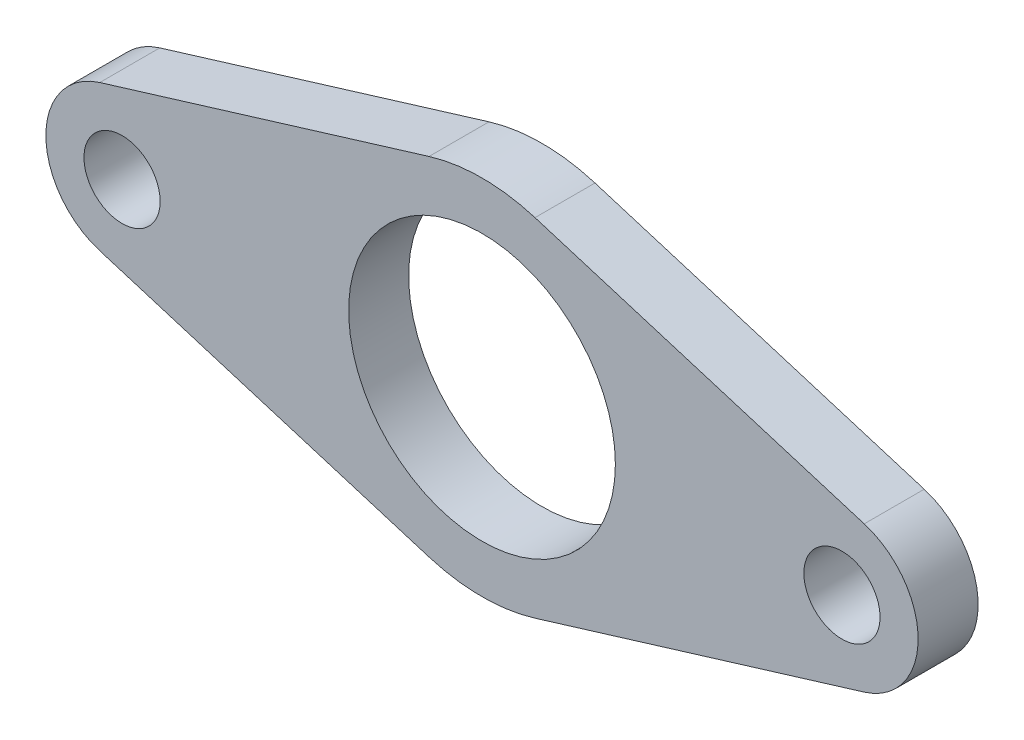
ISO-10303-21;
HEADER;
FILE_DESCRIPTION(('STEP AP214'),'2;1');
FILE_NAME('part.step','',(''),(''),'','','');
FILE_SCHEMA(('AUTOMOTIVE_DESIGN { 1 0 10303 214 1 1 1 1 }'));
ENDSEC;
DATA;
#1=APPLICATION_CONTEXT('core data for automotive mechanical design processes');
#2=APPLICATION_PROTOCOL_DEFINITION('international standard','automotive_design',2000,#1);
#3=PRODUCT_CONTEXT('',#1,'mechanical');
#4=PRODUCT('Part','Part','',(#3));
#5=PRODUCT_RELATED_PRODUCT_CATEGORY('part','',(#4));
#6=PRODUCT_DEFINITION_FORMATION('','',#4);
#7=PRODUCT_DEFINITION_CONTEXT('part definition',#1,'design');
#8=PRODUCT_DEFINITION('design','',#6,#7);
#9=PRODUCT_DEFINITION_SHAPE('','',#8);
#10=(LENGTH_UNIT() NAMED_UNIT(*) SI_UNIT(.MILLI.,.METRE.));
#11=(NAMED_UNIT(*) PLANE_ANGLE_UNIT() SI_UNIT($,.RADIAN.));
#12=(NAMED_UNIT(*) SI_UNIT($,.STERADIAN.) SOLID_ANGLE_UNIT());
#13=UNCERTAINTY_MEASURE_WITH_UNIT(LENGTH_MEASURE(1.E-05),#10,'distance_accuracy_value','');
#14=(GEOMETRIC_REPRESENTATION_CONTEXT(3) GLOBAL_UNCERTAINTY_ASSIGNED_CONTEXT((#13)) GLOBAL_UNIT_ASSIGNED_CONTEXT((#10,
#11,#12)) REPRESENTATION_CONTEXT('',''));
#15=CARTESIAN_POINT('',(0.,0.,0.));
#16=DIRECTION('',(0.,0.,1.));
#17=DIRECTION('',(1.,0.,0.));
#18=AXIS2_PLACEMENT_3D('',#15,#16,#17);
#19=CARTESIAN_POINT('',(-30.,0.,5.));
#20=DIRECTION('',(0.,0.,1.));
#21=DIRECTION('',(1.,0.,0.));
#22=AXIS2_PLACEMENT_3D('',#19,#20,#21);
#23=PLANE('',#22);
#24=CARTESIAN_POINT('',(-30.,0.,5.));
#25=DIRECTION('',(0.,0.,1.));
#26=DIRECTION('',(1.,0.,0.));
#27=AXIS2_PLACEMENT_3D('',#24,#25,#26);
#28=CIRCLE('',#27,3.175);
#29=CARTESIAN_POINT('',(-26.825,0.,5.));
#30=VERTEX_POINT('',#29);
#31=EDGE_CURVE('E185',#30,#30,#28,.T.);
#32=ORIENTED_EDGE('',*,*,#31,.F.);
#33=EDGE_LOOP('',(#32));
#34=FACE_BOUND('',#33,.T.);
#35=CARTESIAN_POINT('',(-30.,0.,5.));
#36=DIRECTION('',(0.,0.,1.));
#37=DIRECTION('',(1.,0.,0.));
#38=AXIS2_PLACEMENT_3D('',#35,#36,#37);
#39=CIRCLE('',#38,6.35);
#40=CARTESIAN_POINT('',(-31.8552583333333,6.07293310654722,5.));
#41=VERTEX_POINT('',#40);
#42=CARTESIAN_POINT('',(-31.8552583333333,-6.07293310654722,5.));
#43=VERTEX_POINT('',#42);
#44=EDGE_CURVE('E148',#41,#43,#39,.T.);
#45=ORIENTED_EDGE('',*,*,#44,.T.);
#46=DIRECTION('',(0.956367418353892,-0.292166666666667,0.));
#47=VECTOR('',#46,1.);
#48=CARTESIAN_POINT('',(-31.8552583333333,-6.07293310654722,5.));
#49=LINE('',#48,#47);
#50=CARTESIAN_POINT('',(-4.41609916666667,-14.4554935284191,5.));
#51=VERTEX_POINT('',#50);
#52=EDGE_CURVE('E96',#43,#51,#49,.T.);
#53=ORIENTED_EDGE('',*,*,#52,.T.);
#54=CARTESIAN_POINT('',(0.,0.,5.));
#55=DIRECTION('',(0.,0.,1.));
#56=DIRECTION('',(1.,0.,0.));
#57=AXIS2_PLACEMENT_3D('',#54,#55,#56);
#58=CIRCLE('',#57,15.115);
#59=CARTESIAN_POINT('',(4.41609916666667,-14.4554935284191,5.));
#60=VERTEX_POINT('',#59);
#61=EDGE_CURVE('E163',#51,#60,#58,.T.);
#62=ORIENTED_EDGE('',*,*,#61,.T.);
#63=DIRECTION('',(0.956367418353892,0.292166666666667,0.));
#64=VECTOR('',#63,1.);
#65=CARTESIAN_POINT('',(31.8552583333333,-6.07293310654722,5.));
#66=LINE('',#65,#64);
#67=CARTESIAN_POINT('',(31.8552583333333,-6.07293310654721,5.));
#68=VERTEX_POINT('',#67);
#69=EDGE_CURVE('E176',#60,#68,#66,.T.);
#70=ORIENTED_EDGE('',*,*,#69,.T.);
#71=CARTESIAN_POINT('',(30.,0.,5.));
#72=DIRECTION('',(0.,0.,1.));
#73=DIRECTION('',(-1.,0.,0.));
#74=AXIS2_PLACEMENT_3D('',#71,#72,#73);
#75=CIRCLE('',#74,6.35);
#76=CARTESIAN_POINT('',(31.8552583333333,6.07293310654722,5.));
#77=VERTEX_POINT('',#76);
#78=EDGE_CURVE('E115',#68,#77,#75,.T.);
#79=ORIENTED_EDGE('',*,*,#78,.T.);
#80=DIRECTION('',(-0.956367418353892,0.292166666666667,0.));
#81=VECTOR('',#80,1.);
#82=CARTESIAN_POINT('',(31.8552583333333,6.07293310654722,5.));
#83=LINE('',#82,#81);
#84=CARTESIAN_POINT('',(4.41609916666667,14.4554935284191,5.));
#85=VERTEX_POINT('',#84);
#86=EDGE_CURVE('E109',#77,#85,#83,.T.);
#87=ORIENTED_EDGE('',*,*,#86,.T.);
#88=CARTESIAN_POINT('',(0.,0.,5.));
#89=DIRECTION('',(0.,0.,1.));
#90=DIRECTION('',(1.,0.,0.));
#91=AXIS2_PLACEMENT_3D('',#88,#89,#90);
#92=CIRCLE('',#91,15.115);
#93=CARTESIAN_POINT('',(-4.41609916666667,14.4554935284191,5.));
#94=VERTEX_POINT('',#93);
#95=EDGE_CURVE('E113',#85,#94,#92,.T.);
#96=ORIENTED_EDGE('',*,*,#95,.T.);
#97=DIRECTION('',(-0.956367418353892,-0.292166666666667,0.));
#98=VECTOR('',#97,1.);
#99=CARTESIAN_POINT('',(-31.8552583333333,6.07293310654722,5.));
#100=LINE('',#99,#98);
#101=EDGE_CURVE('E53',#94,#41,#100,.T.);
#102=ORIENTED_EDGE('',*,*,#101,.T.);
#103=EDGE_LOOP('',(#45,#53,#62,#70,#79,#87,#96,#102));
#104=FACE_BOUND('',#103,.T.);
#105=CARTESIAN_POINT('',(0.,0.,5.));
#106=DIRECTION('',(0.,0.,1.));
#107=DIRECTION('',(1.,0.,0.));
#108=AXIS2_PLACEMENT_3D('',#105,#106,#107);
#109=CIRCLE('',#108,11.115);
#110=CARTESIAN_POINT('',(11.115,0.,5.));
#111=VERTEX_POINT('',#110);
#112=EDGE_CURVE('E137',#111,#111,#109,.T.);
#113=ORIENTED_EDGE('',*,*,#112,.F.);
#114=EDGE_LOOP('',(#113));
#115=FACE_BOUND('',#114,.T.);
#116=CARTESIAN_POINT('',(30.,0.,5.));
#117=DIRECTION('',(0.,0.,1.));
#118=DIRECTION('',(-1.,0.,0.));
#119=AXIS2_PLACEMENT_3D('',#116,#117,#118);
#120=CIRCLE('',#119,3.175);
#121=CARTESIAN_POINT('',(26.825,0.,5.));
#122=VERTEX_POINT('',#121);
#123=EDGE_CURVE('E191',#122,#122,#120,.T.);
#124=ORIENTED_EDGE('',*,*,#123,.F.);
#125=EDGE_LOOP('',(#124));
#126=FACE_BOUND('',#125,.T.);
#127=ADVANCED_FACE('F36',(#34,#104,#115,#126),#23,.T.);
#128=CARTESIAN_POINT('',(-30.,0.,0.));
#129=DIRECTION('',(0.,0.,1.));
#130=DIRECTION('',(1.,0.,0.));
#131=AXIS2_PLACEMENT_3D('',#128,#129,#130);
#132=PLANE('',#131);
#133=CARTESIAN_POINT('',(-30.,0.,0.));
#134=DIRECTION('',(0.,0.,1.));
#135=DIRECTION('',(1.,0.,0.));
#136=AXIS2_PLACEMENT_3D('',#133,#134,#135);
#137=CIRCLE('',#136,6.35);
#138=CARTESIAN_POINT('',(-31.8552583333333,6.07293310654722,0.));
#139=VERTEX_POINT('',#138);
#140=CARTESIAN_POINT('',(-31.8552583333333,-6.07293310654722,0.));
#141=VERTEX_POINT('',#140);
#142=EDGE_CURVE('E133',#139,#141,#137,.T.);
#143=ORIENTED_EDGE('',*,*,#142,.F.);
#144=DIRECTION('',(-0.956367418353892,-0.292166666666667,0.));
#145=VECTOR('',#144,1.);
#146=CARTESIAN_POINT('',(-31.8552583333333,6.07293310654722,0.));
#147=LINE('',#146,#145);
#148=CARTESIAN_POINT('',(-4.41609916666667,14.4554935284191,0.));
#149=VERTEX_POINT('',#148);
#150=EDGE_CURVE('E88',#149,#139,#147,.T.);
#151=ORIENTED_EDGE('',*,*,#150,.F.);
#152=CARTESIAN_POINT('',(0.,0.,0.));
#153=DIRECTION('',(0.,0.,1.));
#154=DIRECTION('',(1.,0.,0.));
#155=AXIS2_PLACEMENT_3D('',#152,#153,#154);
#156=CIRCLE('',#155,15.115);
#157=CARTESIAN_POINT('',(4.41609916666667,14.4554935284191,0.));
#158=VERTEX_POINT('',#157);
#159=EDGE_CURVE('E82',#158,#149,#156,.T.);
#160=ORIENTED_EDGE('',*,*,#159,.F.);
#161=DIRECTION('',(-0.956367418353892,0.292166666666667,0.));
#162=VECTOR('',#161,1.);
#163=CARTESIAN_POINT('',(31.8552583333333,6.07293310654722,0.));
#164=LINE('',#163,#162);
#165=CARTESIAN_POINT('',(31.8552583333333,6.07293310654722,0.));
#166=VERTEX_POINT('',#165);
#167=EDGE_CURVE('E123',#166,#158,#164,.T.);
#168=ORIENTED_EDGE('',*,*,#167,.F.);
#169=CARTESIAN_POINT('',(30.,0.,0.));
#170=DIRECTION('',(0.,0.,1.));
#171=DIRECTION('',(-1.,0.,0.));
#172=AXIS2_PLACEMENT_3D('',#169,#170,#171);
#173=CIRCLE('',#172,6.35);
#174=CARTESIAN_POINT('',(31.8552583333333,-6.07293310654721,0.));
#175=VERTEX_POINT('',#174);
#176=EDGE_CURVE('E143',#175,#166,#173,.T.);
#177=ORIENTED_EDGE('',*,*,#176,.F.);
#178=DIRECTION('',(0.956367418353892,0.292166666666667,0.));
#179=VECTOR('',#178,1.);
#180=CARTESIAN_POINT('',(31.8552583333333,-6.07293310654722,0.));
#181=LINE('',#180,#179);
#182=CARTESIAN_POINT('',(4.41609916666667,-14.4554935284191,0.));
#183=VERTEX_POINT('',#182);
#184=EDGE_CURVE('E141',#183,#175,#181,.T.);
#185=ORIENTED_EDGE('',*,*,#184,.F.);
#186=CARTESIAN_POINT('',(0.,0.,0.));
#187=DIRECTION('',(0.,0.,1.));
#188=DIRECTION('',(1.,0.,0.));
#189=AXIS2_PLACEMENT_3D('',#186,#187,#188);
#190=CIRCLE('',#189,15.115);
#191=CARTESIAN_POINT('',(-4.41609916666667,-14.4554935284191,0.));
#192=VERTEX_POINT('',#191);
#193=EDGE_CURVE('E139',#192,#183,#190,.T.);
#194=ORIENTED_EDGE('',*,*,#193,.F.);
#195=DIRECTION('',(0.956367418353892,-0.292166666666667,0.));
#196=VECTOR('',#195,1.);
#197=CARTESIAN_POINT('',(-31.8552583333333,-6.07293310654722,0.));
#198=LINE('',#197,#196);
#199=EDGE_CURVE('E136',#141,#192,#198,.T.);
#200=ORIENTED_EDGE('',*,*,#199,.F.);
#201=EDGE_LOOP('',(#143,#151,#160,#168,#177,#185,#194,#200));
#202=FACE_BOUND('',#201,.T.);
#203=CARTESIAN_POINT('',(0.,0.,0.));
#204=DIRECTION('',(0.,0.,1.));
#205=DIRECTION('',(1.,0.,0.));
#206=AXIS2_PLACEMENT_3D('',#203,#204,#205);
#207=CIRCLE('',#206,11.115);
#208=CARTESIAN_POINT('',(11.115,0.,0.));
#209=VERTEX_POINT('',#208);
#210=EDGE_CURVE('E182',#209,#209,#207,.T.);
#211=ORIENTED_EDGE('',*,*,#210,.T.);
#212=EDGE_LOOP('',(#211));
#213=FACE_BOUND('',#212,.T.);
#214=CARTESIAN_POINT('',(-30.,0.,0.));
#215=DIRECTION('',(0.,0.,1.));
#216=DIRECTION('',(1.,0.,0.));
#217=AXIS2_PLACEMENT_3D('',#214,#215,#216);
#218=CIRCLE('',#217,3.175);
#219=CARTESIAN_POINT('',(-26.825,0.,0.));
#220=VERTEX_POINT('',#219);
#221=EDGE_CURVE('E188',#220,#220,#218,.T.);
#222=ORIENTED_EDGE('',*,*,#221,.T.);
#223=EDGE_LOOP('',(#222));
#224=FACE_BOUND('',#223,.T.);
#225=CARTESIAN_POINT('',(30.,0.,0.));
#226=DIRECTION('',(0.,0.,1.));
#227=DIRECTION('',(-1.,0.,0.));
#228=AXIS2_PLACEMENT_3D('',#225,#226,#227);
#229=CIRCLE('',#228,3.175);
#230=CARTESIAN_POINT('',(26.825,0.,0.));
#231=VERTEX_POINT('',#230);
#232=EDGE_CURVE('E194',#231,#231,#229,.T.);
#233=ORIENTED_EDGE('',*,*,#232,.T.);
#234=EDGE_LOOP('',(#233));
#235=FACE_BOUND('',#234,.T.);
#236=ADVANCED_FACE('F167',(#202,#213,#224,#235),#132,.F.);
#237=CARTESIAN_POINT('',(-30.,0.,5.));
#238=DIRECTION('',(0.,0.,-1.));
#239=DIRECTION('',(-1.,0.,0.));
#240=AXIS2_PLACEMENT_3D('',#237,#238,#239);
#241=CYLINDRICAL_SURFACE('',#240,6.35);
#242=ORIENTED_EDGE('',*,*,#142,.T.);
#243=DIRECTION('',(0.,0.,-1.));
#244=VECTOR('',#243,1.);
#245=CARTESIAN_POINT('',(-31.8552583333333,-6.07293310654722,5.));
#246=LINE('',#245,#244);
#247=EDGE_CURVE('E11',#43,#141,#246,.T.);
#248=ORIENTED_EDGE('',*,*,#247,.F.);
#249=ORIENTED_EDGE('',*,*,#44,.F.);
#250=DIRECTION('',(0.,0.,-1.));
#251=VECTOR('',#250,1.);
#252=CARTESIAN_POINT('',(-31.8552583333333,6.07293310654722,5.));
#253=LINE('',#252,#251);
#254=EDGE_CURVE('E129',#41,#139,#253,.T.);
#255=ORIENTED_EDGE('',*,*,#254,.T.);
#256=EDGE_LOOP('',(#242,#248,#249,#255));
#257=FACE_BOUND('',#256,.T.);
#258=ADVANCED_FACE('F38',(#257),#241,.T.);
#259=CARTESIAN_POINT('',(-31.8552583333333,-6.07293310654722,5.));
#260=DIRECTION('',(0.292166666666667,0.956367418353892,0.));
#261=DIRECTION('',(-0.956367418353892,0.292166666666667,0.));
#262=AXIS2_PLACEMENT_3D('',#259,#260,#261);
#263=PLANE('',#262);
#264=ORIENTED_EDGE('',*,*,#199,.T.);
#265=DIRECTION('',(0.,0.,-1.));
#266=VECTOR('',#265,1.);
#267=CARTESIAN_POINT('',(-4.41609916666667,-14.4554935284191,5.));
#268=LINE('',#267,#266);
#269=EDGE_CURVE('E45',#51,#192,#268,.T.);
#270=ORIENTED_EDGE('',*,*,#269,.F.);
#271=ORIENTED_EDGE('',*,*,#52,.F.);
#272=ORIENTED_EDGE('',*,*,#247,.T.);
#273=EDGE_LOOP('',(#264,#270,#271,#272));
#274=FACE_BOUND('',#273,.T.);
#275=ADVANCED_FACE('F227',(#274),#263,.F.);
#276=CARTESIAN_POINT('',(0.,0.,5.));
#277=DIRECTION('',(0.,0.,-1.));
#278=DIRECTION('',(-1.,0.,0.));
#279=AXIS2_PLACEMENT_3D('',#276,#277,#278);
#280=CYLINDRICAL_SURFACE('',#279,15.115);
#281=ORIENTED_EDGE('',*,*,#193,.T.);
#282=DIRECTION('',(0.,0.,-1.));
#283=VECTOR('',#282,1.);
#284=CARTESIAN_POINT('',(4.41609916666667,-14.4554935284191,5.));
#285=LINE('',#284,#283);
#286=EDGE_CURVE('E155',#60,#183,#285,.T.);
#287=ORIENTED_EDGE('',*,*,#286,.F.);
#288=ORIENTED_EDGE('',*,*,#61,.F.);
#289=ORIENTED_EDGE('',*,*,#269,.T.);
#290=EDGE_LOOP('',(#281,#287,#288,#289));
#291=FACE_BOUND('',#290,.T.);
#292=ADVANCED_FACE('F161',(#291),#280,.T.);
#293=CARTESIAN_POINT('',(31.8552583333333,-6.07293310654722,5.));
#294=DIRECTION('',(-0.292166666666667,0.956367418353892,0.));
#295=DIRECTION('',(-0.956367418353892,-0.292166666666667,0.));
#296=AXIS2_PLACEMENT_3D('',#293,#294,#295);
#297=PLANE('',#296);
#298=ORIENTED_EDGE('',*,*,#184,.T.);
#299=DIRECTION('',(0.,0.,-1.));
#300=VECTOR('',#299,1.);
#301=CARTESIAN_POINT('',(31.8552583333333,-6.07293310654721,5.));
#302=LINE('',#301,#300);
#303=EDGE_CURVE('E152',#68,#175,#302,.T.);
#304=ORIENTED_EDGE('',*,*,#303,.F.);
#305=ORIENTED_EDGE('',*,*,#69,.F.);
#306=ORIENTED_EDGE('',*,*,#286,.T.);
#307=EDGE_LOOP('',(#298,#304,#305,#306));
#308=FACE_BOUND('',#307,.T.);
#309=ADVANCED_FACE('F172',(#308),#297,.F.);
#310=CARTESIAN_POINT('',(30.,0.,5.));
#311=DIRECTION('',(0.,0.,-1.));
#312=DIRECTION('',(-1.,0.,0.));
#313=AXIS2_PLACEMENT_3D('',#310,#311,#312);
#314=CYLINDRICAL_SURFACE('',#313,6.35);
#315=ORIENTED_EDGE('',*,*,#176,.T.);
#316=DIRECTION('',(0.,0.,-1.));
#317=VECTOR('',#316,1.);
#318=CARTESIAN_POINT('',(31.8552583333333,6.07293310654722,5.));
#319=LINE('',#318,#317);
#320=EDGE_CURVE('E124',#77,#166,#319,.T.);
#321=ORIENTED_EDGE('',*,*,#320,.F.);
#322=ORIENTED_EDGE('',*,*,#78,.F.);
#323=ORIENTED_EDGE('',*,*,#303,.T.);
#324=EDGE_LOOP('',(#315,#321,#322,#323));
#325=FACE_BOUND('',#324,.T.);
#326=ADVANCED_FACE('F175',(#325),#314,.T.);
#327=CARTESIAN_POINT('',(31.8552583333333,6.07293310654722,5.));
#328=DIRECTION('',(-0.292166666666667,-0.956367418353892,0.));
#329=DIRECTION('',(0.956367418353892,-0.292166666666667,0.));
#330=AXIS2_PLACEMENT_3D('',#327,#328,#329);
#331=PLANE('',#330);
#332=ORIENTED_EDGE('',*,*,#167,.T.);
#333=DIRECTION('',(0.,0.,-1.));
#334=VECTOR('',#333,1.);
#335=CARTESIAN_POINT('',(4.41609916666667,14.4554935284191,5.));
#336=LINE('',#335,#334);
#337=EDGE_CURVE('E120',#85,#158,#336,.T.);
#338=ORIENTED_EDGE('',*,*,#337,.F.);
#339=ORIENTED_EDGE('',*,*,#86,.F.);
#340=ORIENTED_EDGE('',*,*,#320,.T.);
#341=EDGE_LOOP('',(#332,#338,#339,#340));
#342=FACE_BOUND('',#341,.T.);
#343=ADVANCED_FACE('F121',(#342),#331,.F.);
#344=CARTESIAN_POINT('',(0.,0.,5.));
#345=DIRECTION('',(0.,0.,-1.));
#346=DIRECTION('',(-1.,0.,0.));
#347=AXIS2_PLACEMENT_3D('',#344,#345,#346);
#348=CYLINDRICAL_SURFACE('',#347,15.115);
#349=ORIENTED_EDGE('',*,*,#159,.T.);
#350=DIRECTION('',(0.,0.,-1.));
#351=VECTOR('',#350,1.);
#352=CARTESIAN_POINT('',(-4.41609916666667,14.4554935284191,5.));
#353=LINE('',#352,#351);
#354=EDGE_CURVE('E125',#94,#149,#353,.T.);
#355=ORIENTED_EDGE('',*,*,#354,.F.);
#356=ORIENTED_EDGE('',*,*,#95,.F.);
#357=ORIENTED_EDGE('',*,*,#337,.T.);
#358=EDGE_LOOP('',(#349,#355,#356,#357));
#359=FACE_BOUND('',#358,.T.);
#360=ADVANCED_FACE('F127',(#359),#348,.T.);
#361=CARTESIAN_POINT('',(-31.8552583333333,6.07293310654722,5.));
#362=DIRECTION('',(0.292166666666667,-0.956367418353892,0.));
#363=DIRECTION('',(0.956367418353892,0.292166666666667,0.));
#364=AXIS2_PLACEMENT_3D('',#361,#362,#363);
#365=PLANE('',#364);
#366=ORIENTED_EDGE('',*,*,#150,.T.);
#367=ORIENTED_EDGE('',*,*,#254,.F.);
#368=ORIENTED_EDGE('',*,*,#101,.F.);
#369=ORIENTED_EDGE('',*,*,#354,.T.);
#370=EDGE_LOOP('',(#366,#367,#368,#369));
#371=FACE_BOUND('',#370,.T.);
#372=ADVANCED_FACE('F215',(#371),#365,.F.);
#373=CARTESIAN_POINT('',(0.,0.,5.));
#374=DIRECTION('',(0.,0.,-1.));
#375=DIRECTION('',(-1.,0.,0.));
#376=AXIS2_PLACEMENT_3D('',#373,#374,#375);
#377=CYLINDRICAL_SURFACE('',#376,11.115);
#378=ORIENTED_EDGE('',*,*,#112,.T.);
#379=EDGE_LOOP('',(#378));
#380=FACE_BOUND('',#379,.T.);
#381=ORIENTED_EDGE('',*,*,#210,.F.);
#382=EDGE_LOOP('',(#381));
#383=FACE_BOUND('',#382,.T.);
#384=ADVANCED_FACE('F212',(#380,#383),#377,.F.);
#385=CARTESIAN_POINT('',(-30.,0.,5.));
#386=DIRECTION('',(0.,0.,-1.));
#387=DIRECTION('',(-1.,0.,0.));
#388=AXIS2_PLACEMENT_3D('',#385,#386,#387);
#389=CYLINDRICAL_SURFACE('',#388,3.175);
#390=ORIENTED_EDGE('',*,*,#31,.T.);
#391=EDGE_LOOP('',(#390));
#392=FACE_BOUND('',#391,.T.);
#393=ORIENTED_EDGE('',*,*,#221,.F.);
#394=EDGE_LOOP('',(#393));
#395=FACE_BOUND('',#394,.T.);
#396=ADVANCED_FACE('F291',(#392,#395),#389,.F.);
#397=CARTESIAN_POINT('',(30.,0.,5.));
#398=DIRECTION('',(0.,0.,-1.));
#399=DIRECTION('',(-1.,0.,0.));
#400=AXIS2_PLACEMENT_3D('',#397,#398,#399);
#401=CYLINDRICAL_SURFACE('',#400,3.175);
#402=ORIENTED_EDGE('',*,*,#123,.T.);
#403=EDGE_LOOP('',(#402));
#404=FACE_BOUND('',#403,.T.);
#405=ORIENTED_EDGE('',*,*,#232,.F.);
#406=EDGE_LOOP('',(#405));
#407=FACE_BOUND('',#406,.T.);
#408=ADVANCED_FACE('F200',(#404,#407),#401,.F.);
#409=CLOSED_SHELL('',(#127,#236,#258,#275,#292,#309,#326,#343,#360,#372,#384,#396,#408));
#410=MANIFOLD_SOLID_BREP('B2',#409);
#411=ADVANCED_BREP_SHAPE_REPRESENTATION('',(#18,#410),#14);
#412=SHAPE_DEFINITION_REPRESENTATION(#9,#411);
ENDSEC;
END-ISO-10303-21;
